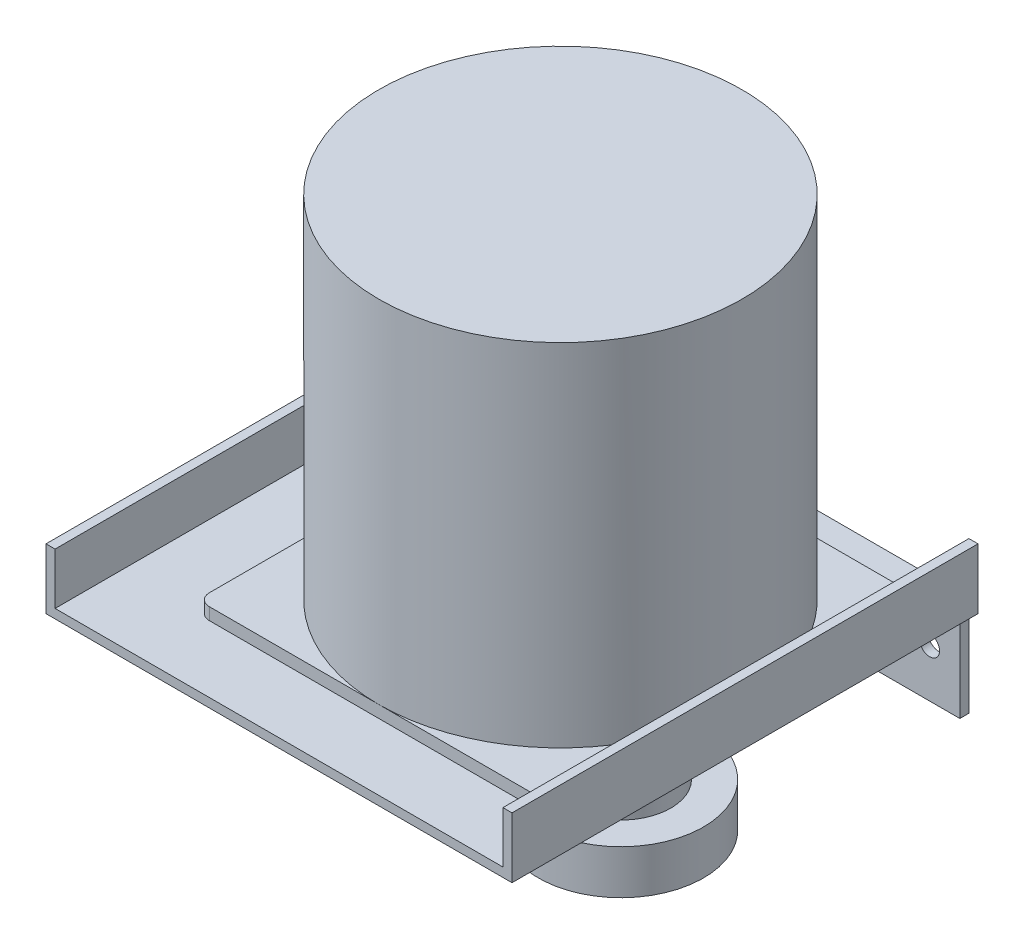
ISO-10303-21;
HEADER;
FILE_DESCRIPTION(('STEP AP214'),'2;1');
FILE_NAME('part.step','',(''),(''),'','','');
FILE_SCHEMA(('AUTOMOTIVE_DESIGN { 1 0 10303 214 1 1 1 1 }'));
ENDSEC;
DATA;
#1=APPLICATION_CONTEXT('core data for automotive mechanical design processes');
#2=APPLICATION_PROTOCOL_DEFINITION('international standard','automotive_design',2000,#1);
#3=PRODUCT_CONTEXT('',#1,'mechanical');
#4=PRODUCT('Part','Part','',(#3));
#5=PRODUCT_RELATED_PRODUCT_CATEGORY('part','',(#4));
#6=PRODUCT_DEFINITION_FORMATION('','',#4);
#7=PRODUCT_DEFINITION_CONTEXT('part definition',#1,'design');
#8=PRODUCT_DEFINITION('design','',#6,#7);
#9=PRODUCT_DEFINITION_SHAPE('','',#8);
#10=(LENGTH_UNIT() NAMED_UNIT(*) SI_UNIT(.MILLI.,.METRE.));
#11=(NAMED_UNIT(*) PLANE_ANGLE_UNIT() SI_UNIT($,.RADIAN.));
#12=(NAMED_UNIT(*) SI_UNIT($,.STERADIAN.) SOLID_ANGLE_UNIT());
#13=UNCERTAINTY_MEASURE_WITH_UNIT(LENGTH_MEASURE(1.E-05),#10,'distance_accuracy_value','');
#14=(GEOMETRIC_REPRESENTATION_CONTEXT(3) GLOBAL_UNCERTAINTY_ASSIGNED_CONTEXT((#13)) GLOBAL_UNIT_ASSIGNED_CONTEXT((#10,
#11,#12)) REPRESENTATION_CONTEXT('',''));
#15=CARTESIAN_POINT('',(0.,0.,0.));
#16=DIRECTION('',(0.,0.,1.));
#17=DIRECTION('',(1.,0.,0.));
#18=AXIS2_PLACEMENT_3D('',#15,#16,#17);
#19=CARTESIAN_POINT('',(-44.,-3.5,-36.));
#20=DIRECTION('',(0.,0.,1.));
#21=DIRECTION('',(1.,0.,0.));
#22=AXIS2_PLACEMENT_3D('',#19,#20,#21);
#23=PLANE('',#22);
#24=CARTESIAN_POINT('',(26.5,-10.5,-36.));
#25=DIRECTION('',(0.,0.,-1.));
#26=DIRECTION('',(-1.,0.,0.));
#27=AXIS2_PLACEMENT_3D('',#24,#25,#26);
#28=CIRCLE('',#27,1.65);
#29=CARTESIAN_POINT('',(24.85,-10.5,-36.));
#30=VERTEX_POINT('',#29);
#31=EDGE_CURVE('E661',#30,#30,#28,.T.);
#32=ORIENTED_EDGE('',*,*,#31,.F.);
#33=EDGE_LOOP('',(#32));
#34=FACE_BOUND('',#33,.T.);
#35=DIRECTION('',(0.,1.,0.));
#36=VECTOR('',#35,1.);
#37=CARTESIAN_POINT('',(-44.,-3.5,-36.));
#38=LINE('',#37,#36);
#39=CARTESIAN_POINT('',(-44.,-3.5,-36.));
#40=VERTEX_POINT('',#39);
#41=CARTESIAN_POINT('',(-44.,6.5,-36.));
#42=VERTEX_POINT('',#41);
#43=EDGE_CURVE('E269',#40,#42,#38,.T.);
#44=ORIENTED_EDGE('',*,*,#43,.T.);
#45=DIRECTION('',(-1.,0.,0.));
#46=VECTOR('',#45,1.);
#47=CARTESIAN_POINT('',(-44.,6.5,-36.));
#48=LINE('',#47,#46);
#49=CARTESIAN_POINT('',(-42.5,6.5,-36.));
#50=VERTEX_POINT('',#49);
#51=EDGE_CURVE('E225',#50,#42,#48,.T.);
#52=ORIENTED_EDGE('',*,*,#51,.F.);
#53=DIRECTION('',(0.,-1.,0.));
#54=VECTOR('',#53,1.);
#55=CARTESIAN_POINT('',(-42.5,6.5,-36.));
#56=LINE('',#55,#54);
#57=CARTESIAN_POINT('',(-42.5,-2.,-36.));
#58=VERTEX_POINT('',#57);
#59=EDGE_CURVE('E227',#50,#58,#56,.T.);
#60=ORIENTED_EDGE('',*,*,#59,.T.);
#61=DIRECTION('',(1.,0.,0.));
#62=VECTOR('',#61,1.);
#63=CARTESIAN_POINT('',(-44.,-2.,-36.));
#64=LINE('',#63,#62);
#65=CARTESIAN_POINT('',(31.5,-2.,-36.));
#66=VERTEX_POINT('',#65);
#67=EDGE_CURVE('E258',#58,#66,#64,.T.);
#68=ORIENTED_EDGE('',*,*,#67,.T.);
#69=DIRECTION('',(0.,-1.,0.));
#70=VECTOR('',#69,1.);
#71=CARTESIAN_POINT('',(31.5,6.5,-36.));
#72=LINE('',#71,#70);
#73=CARTESIAN_POINT('',(31.5,6.5,-36.));
#74=VERTEX_POINT('',#73);
#75=EDGE_CURVE('E250',#74,#66,#72,.T.);
#76=ORIENTED_EDGE('',*,*,#75,.F.);
#77=DIRECTION('',(-1.,0.,0.));
#78=VECTOR('',#77,1.);
#79=CARTESIAN_POINT('',(33.,6.5,-36.));
#80=LINE('',#79,#78);
#81=CARTESIAN_POINT('',(33.,6.5,-36.));
#82=VERTEX_POINT('',#81);
#83=EDGE_CURVE('E238',#82,#74,#80,.T.);
#84=ORIENTED_EDGE('',*,*,#83,.F.);
#85=DIRECTION('',(0.,1.,0.));
#86=VECTOR('',#85,1.);
#87=CARTESIAN_POINT('',(33.,-3.5,-36.));
#88=LINE('',#87,#86);
#89=CARTESIAN_POINT('',(33.,-3.5,-36.));
#90=VERTEX_POINT('',#89);
#91=EDGE_CURVE('E272',#90,#82,#88,.T.);
#92=ORIENTED_EDGE('',*,*,#91,.F.);
#93=DIRECTION('',(1.,0.,0.));
#94=VECTOR('',#93,1.);
#95=CARTESIAN_POINT('',(-44.,-3.5,-36.));
#96=LINE('',#95,#94);
#97=CARTESIAN_POINT('',(31.5,-3.5,-36.));
#98=VERTEX_POINT('',#97);
#99=EDGE_CURVE('E263',#98,#90,#96,.T.);
#100=ORIENTED_EDGE('',*,*,#99,.F.);
#101=DIRECTION('',(0.,1.,0.));
#102=VECTOR('',#101,1.);
#103=CARTESIAN_POINT('',(31.5,-18.5,-36.));
#104=LINE('',#103,#102);
#105=CARTESIAN_POINT('',(31.5,-18.5,-36.));
#106=VERTEX_POINT('',#105);
#107=EDGE_CURVE('E194',#106,#98,#104,.T.);
#108=ORIENTED_EDGE('',*,*,#107,.F.);
#109=DIRECTION('',(1.,0.,0.));
#110=VECTOR('',#109,1.);
#111=CARTESIAN_POINT('',(-42.5,-18.5,-36.));
#112=LINE('',#111,#110);
#113=CARTESIAN_POINT('',(-42.5,-18.5,-36.));
#114=VERTEX_POINT('',#113);
#115=EDGE_CURVE('E187',#114,#106,#112,.T.);
#116=ORIENTED_EDGE('',*,*,#115,.F.);
#117=DIRECTION('',(0.,1.,0.));
#118=VECTOR('',#117,1.);
#119=CARTESIAN_POINT('',(-42.5,-18.5,-36.));
#120=LINE('',#119,#118);
#121=CARTESIAN_POINT('',(-42.5,-3.5,-36.));
#122=VERTEX_POINT('',#121);
#123=EDGE_CURVE('E192',#114,#122,#120,.T.);
#124=ORIENTED_EDGE('',*,*,#123,.T.);
#125=EDGE_CURVE('E264',#40,#122,#96,.T.);
#126=ORIENTED_EDGE('',*,*,#125,.F.);
#127=EDGE_LOOP('',(#44,#52,#60,#68,#76,#84,#92,#100,#108,#116,#124,#126));
#128=FACE_BOUND('',#127,.T.);
#129=CARTESIAN_POINT('',(-37.5,-10.5,-36.));
#130=DIRECTION('',(0.,0.,-1.));
#131=DIRECTION('',(-1.,0.,0.));
#132=AXIS2_PLACEMENT_3D('',#129,#130,#131);
#133=CIRCLE('',#132,1.65);
#134=CARTESIAN_POINT('',(-39.15,-10.5,-36.));
#135=VERTEX_POINT('',#134);
#136=EDGE_CURVE('E667',#135,#135,#133,.T.);
#137=ORIENTED_EDGE('',*,*,#136,.F.);
#138=EDGE_LOOP('',(#137));
#139=FACE_BOUND('',#138,.T.);
#140=ADVANCED_FACE('F39',(#34,#128,#139),#23,.F.);
#141=CARTESIAN_POINT('',(0.,-3.5,0.));
#142=DIRECTION('',(0.,1.,0.));
#143=DIRECTION('',(0.,0.,1.));
#144=AXIS2_PLACEMENT_3D('',#141,#142,#143);
#145=PLANE('',#144);
#146=CARTESIAN_POINT('',(9.5,-3.5,-0.5));
#147=DIRECTION('',(0.,1.,0.));
#148=DIRECTION('',(0.,0.,1.));
#149=AXIS2_PLACEMENT_3D('',#146,#147,#148);
#150=CIRCLE('',#149,3.5);
#151=CARTESIAN_POINT('',(9.5,-3.5,3.));
#152=VERTEX_POINT('',#151);
#153=EDGE_CURVE('E11',#152,#152,#150,.F.);
#154=ORIENTED_EDGE('',*,*,#153,.F.);
#155=EDGE_LOOP('',(#154));
#156=FACE_BOUND('',#155,.T.);
#157=DIRECTION('',(0.,0.,-1.));
#158=VECTOR('',#157,1.);
#159=CARTESIAN_POINT('',(-42.5,-3.5,-36.));
#160=LINE('',#159,#158);
#161=CARTESIAN_POINT('',(-42.5,-3.5,-34.5));
#162=VERTEX_POINT('',#161);
#163=EDGE_CURVE('E54',#162,#122,#160,.T.);
#164=ORIENTED_EDGE('',*,*,#163,.F.);
#165=DIRECTION('',(-1.,0.,0.));
#166=VECTOR('',#165,1.);
#167=CARTESIAN_POINT('',(-42.5,-3.5,-34.5));
#168=LINE('',#167,#166);
#169=CARTESIAN_POINT('',(31.5,-3.5,-34.5));
#170=VERTEX_POINT('',#169);
#171=EDGE_CURVE('E207',#170,#162,#168,.T.);
#172=ORIENTED_EDGE('',*,*,#171,.F.);
#173=DIRECTION('',(0.,0.,1.));
#174=VECTOR('',#173,1.);
#175=CARTESIAN_POINT('',(31.5,-3.5,-36.));
#176=LINE('',#175,#174);
#177=EDGE_CURVE('E60',#98,#170,#176,.T.);
#178=ORIENTED_EDGE('',*,*,#177,.F.);
#179=ORIENTED_EDGE('',*,*,#99,.T.);
#180=DIRECTION('',(0.,0.,1.));
#181=VECTOR('',#180,1.);
#182=CARTESIAN_POINT('',(33.,-3.5,-36.));
#183=LINE('',#182,#181);
#184=CARTESIAN_POINT('',(33.,-3.5,41.));
#185=VERTEX_POINT('',#184);
#186=EDGE_CURVE('E261',#90,#185,#183,.T.);
#187=ORIENTED_EDGE('',*,*,#186,.T.);
#188=DIRECTION('',(1.,0.,0.));
#189=VECTOR('',#188,1.);
#190=CARTESIAN_POINT('',(-44.,-3.5,41.));
#191=LINE('',#190,#189);
#192=CARTESIAN_POINT('',(-44.,-3.5,41.));
#193=VERTEX_POINT('',#192);
#194=EDGE_CURVE('E257',#193,#185,#191,.T.);
#195=ORIENTED_EDGE('',*,*,#194,.F.);
#196=DIRECTION('',(0.,0.,1.));
#197=VECTOR('',#196,1.);
#198=CARTESIAN_POINT('',(-44.,-3.5,-36.));
#199=LINE('',#198,#197);
#200=EDGE_CURVE('E254',#40,#193,#199,.T.);
#201=ORIENTED_EDGE('',*,*,#200,.F.);
#202=ORIENTED_EDGE('',*,*,#125,.T.);
#203=EDGE_LOOP('',(#164,#172,#178,#179,#187,#195,#201,#202));
#204=FACE_BOUND('',#203,.T.);
#205=ADVANCED_FACE('F413',(#156,#204),#145,.F.);
#206=CARTESIAN_POINT('',(0.,-2.,0.));
#207=DIRECTION('',(0.,1.,0.));
#208=DIRECTION('',(0.,0.,1.));
#209=AXIS2_PLACEMENT_3D('',#206,#207,#208);
#210=PLANE('',#209);
#211=CARTESIAN_POINT('',(28.,-2.,28.));
#212=DIRECTION('',(0.,1.,0.));
#213=DIRECTION('',(0.,0.,1.));
#214=AXIS2_PLACEMENT_3D('',#211,#212,#213);
#215=CIRCLE('',#214,2.);
#216=CARTESIAN_POINT('',(30.,-2.,28.));
#217=VERTEX_POINT('',#216);
#218=CARTESIAN_POINT('',(28.,-2.,30.));
#219=VERTEX_POINT('',#218);
#220=EDGE_CURVE('E320',#217,#219,#215,.F.);
#221=ORIENTED_EDGE('',*,*,#220,.T.);
#222=DIRECTION('',(-1.,0.,0.));
#223=VECTOR('',#222,1.);
#224=CARTESIAN_POINT('',(-30.,-2.,30.));
#225=LINE('',#224,#223);
#226=CARTESIAN_POINT('',(-28.,-2.,30.));
#227=VERTEX_POINT('',#226);
#228=EDGE_CURVE('E280',#219,#227,#225,.T.);
#229=ORIENTED_EDGE('',*,*,#228,.T.);
#230=CARTESIAN_POINT('',(-28.,-2.,28.));
#231=DIRECTION('',(0.,1.,0.));
#232=DIRECTION('',(0.,0.,1.));
#233=AXIS2_PLACEMENT_3D('',#230,#231,#232);
#234=CIRCLE('',#233,2.);
#235=CARTESIAN_POINT('',(-30.,-2.,28.));
#236=VERTEX_POINT('',#235);
#237=EDGE_CURVE('E329',#227,#236,#234,.F.);
#238=ORIENTED_EDGE('',*,*,#237,.T.);
#239=DIRECTION('',(0.,0.,-1.));
#240=VECTOR('',#239,1.);
#241=CARTESIAN_POINT('',(-30.,-2.,-30.));
#242=LINE('',#241,#240);
#243=CARTESIAN_POINT('',(-30.,-2.,-28.));
#244=VERTEX_POINT('',#243);
#245=EDGE_CURVE('E284',#236,#244,#242,.T.);
#246=ORIENTED_EDGE('',*,*,#245,.T.);
#247=CARTESIAN_POINT('',(-28.,-2.,-28.));
#248=DIRECTION('',(0.,1.,0.));
#249=DIRECTION('',(0.,0.,1.));
#250=AXIS2_PLACEMENT_3D('',#247,#248,#249);
#251=CIRCLE('',#250,2.);
#252=CARTESIAN_POINT('',(-28.,-2.,-30.));
#253=VERTEX_POINT('',#252);
#254=EDGE_CURVE('E326',#244,#253,#251,.F.);
#255=ORIENTED_EDGE('',*,*,#254,.T.);
#256=DIRECTION('',(1.,0.,0.));
#257=VECTOR('',#256,1.);
#258=CARTESIAN_POINT('',(-30.,-2.,-30.));
#259=LINE('',#258,#257);
#260=CARTESIAN_POINT('',(28.,-2.,-30.));
#261=VERTEX_POINT('',#260);
#262=EDGE_CURVE('E287',#253,#261,#259,.T.);
#263=ORIENTED_EDGE('',*,*,#262,.T.);
#264=CARTESIAN_POINT('',(28.,-2.,-28.));
#265=DIRECTION('',(0.,1.,0.));
#266=DIRECTION('',(0.,0.,1.));
#267=AXIS2_PLACEMENT_3D('',#264,#265,#266);
#268=CIRCLE('',#267,2.);
#269=CARTESIAN_POINT('',(30.,-2.,-28.));
#270=VERTEX_POINT('',#269);
#271=EDGE_CURVE('E323',#261,#270,#268,.F.);
#272=ORIENTED_EDGE('',*,*,#271,.T.);
#273=DIRECTION('',(0.,0.,1.));
#274=VECTOR('',#273,1.);
#275=CARTESIAN_POINT('',(30.,-2.,-30.));
#276=LINE('',#275,#274);
#277=EDGE_CURVE('E277',#270,#217,#276,.T.);
#278=ORIENTED_EDGE('',*,*,#277,.T.);
#279=EDGE_LOOP('',(#221,#229,#238,#246,#255,#263,#272,#278));
#280=FACE_BOUND('',#279,.T.);
#281=ORIENTED_EDGE('',*,*,#67,.F.);
#282=DIRECTION('',(0.,0.,-1.));
#283=VECTOR('',#282,1.);
#284=CARTESIAN_POINT('',(-42.5,-2.,41.));
#285=LINE('',#284,#283);
#286=CARTESIAN_POINT('',(-42.5,-2.,41.));
#287=VERTEX_POINT('',#286);
#288=EDGE_CURVE('E210',#287,#58,#285,.T.);
#289=ORIENTED_EDGE('',*,*,#288,.F.);
#290=DIRECTION('',(1.,0.,0.));
#291=VECTOR('',#290,1.);
#292=CARTESIAN_POINT('',(-44.,-2.,41.));
#293=LINE('',#292,#291);
#294=CARTESIAN_POINT('',(31.5,-2.,41.));
#295=VERTEX_POINT('',#294);
#296=EDGE_CURVE('E253',#287,#295,#293,.T.);
#297=ORIENTED_EDGE('',*,*,#296,.T.);
#298=DIRECTION('',(0.,0.,1.));
#299=VECTOR('',#298,1.);
#300=CARTESIAN_POINT('',(31.5,-2.,41.));
#301=LINE('',#300,#299);
#302=EDGE_CURVE('E234',#66,#295,#301,.T.);
#303=ORIENTED_EDGE('',*,*,#302,.F.);
#304=EDGE_LOOP('',(#281,#289,#297,#303));
#305=FACE_BOUND('',#304,.T.);
#306=ADVANCED_FACE('F360',(#280,#305),#210,.T.);
#307=CARTESIAN_POINT('',(0.,58.,0.));
#308=DIRECTION('',(0.,-1.,0.));
#309=DIRECTION('',(0.,0.,-1.));
#310=AXIS2_PLACEMENT_3D('',#307,#308,#309);
#311=CYLINDRICAL_SURFACE('',#310,30.);
#312=CARTESIAN_POINT('',(0.,58.,0.));
#313=DIRECTION('',(0.,1.,0.));
#314=DIRECTION('',(0.,0.,1.));
#315=AXIS2_PLACEMENT_3D('',#312,#313,#314);
#316=CIRCLE('',#315,30.);
#317=CARTESIAN_POINT('',(0.,58.,30.));
#318=VERTEX_POINT('',#317);
#319=EDGE_CURVE('E301',#318,#318,#316,.T.);
#320=ORIENTED_EDGE('',*,*,#319,.F.);
#321=EDGE_LOOP('',(#320));
#322=FACE_BOUND('',#321,.T.);
#323=CARTESIAN_POINT('',(0.,0.,0.));
#324=DIRECTION('',(0.,1.,0.));
#325=DIRECTION('',(0.,0.,1.));
#326=AXIS2_PLACEMENT_3D('',#323,#324,#325);
#327=CIRCLE('',#326,30.);
#328=CARTESIAN_POINT('',(0.,0.,30.));
#329=VERTEX_POINT('',#328);
#330=CARTESIAN_POINT('',(30.,0.,0.));
#331=VERTEX_POINT('',#330);
#332=EDGE_CURVE('E305',#329,#331,#327,.T.);
#333=ORIENTED_EDGE('',*,*,#332,.T.);
#334=CARTESIAN_POINT('',(0.,0.,-30.));
#335=VERTEX_POINT('',#334);
#336=EDGE_CURVE('E308',#331,#335,#327,.T.);
#337=ORIENTED_EDGE('',*,*,#336,.T.);
#338=CARTESIAN_POINT('',(-30.,0.,0.));
#339=VERTEX_POINT('',#338);
#340=EDGE_CURVE('E380',#335,#339,#327,.T.);
#341=ORIENTED_EDGE('',*,*,#340,.T.);
#342=EDGE_CURVE('E290',#339,#329,#327,.T.);
#343=ORIENTED_EDGE('',*,*,#342,.T.);
#344=EDGE_LOOP('',(#333,#337,#341,#343));
#345=FACE_BOUND('',#344,.T.);
#346=ADVANCED_FACE('F386',(#322,#345),#311,.T.);
#347=CARTESIAN_POINT('',(0.,58.,0.));
#348=DIRECTION('',(0.,1.,0.));
#349=DIRECTION('',(0.,0.,1.));
#350=AXIS2_PLACEMENT_3D('',#347,#348,#349);
#351=PLANE('',#350);
#352=ORIENTED_EDGE('',*,*,#319,.T.);
#353=EDGE_LOOP('',(#352));
#354=FACE_BOUND('',#353,.T.);
#355=ADVANCED_FACE('F439',(#354),#351,.T.);
#356=CARTESIAN_POINT('',(0.,0.,0.));
#357=DIRECTION('',(0.,1.,0.));
#358=DIRECTION('',(0.,0.,1.));
#359=AXIS2_PLACEMENT_3D('',#356,#357,#358);
#360=PLANE('',#359);
#361=DIRECTION('',(-1.,0.,0.));
#362=VECTOR('',#361,1.);
#363=CARTESIAN_POINT('',(-30.,0.,30.));
#364=LINE('',#363,#362);
#365=CARTESIAN_POINT('',(28.,0.,30.));
#366=VERTEX_POINT('',#365);
#367=EDGE_CURVE('E294',#366,#329,#364,.T.);
#368=ORIENTED_EDGE('',*,*,#367,.F.);
#369=CARTESIAN_POINT('',(28.,0.,28.));
#370=DIRECTION('',(0.,1.,0.));
#371=DIRECTION('',(0.,0.,1.));
#372=AXIS2_PLACEMENT_3D('',#369,#370,#371);
#373=CIRCLE('',#372,2.);
#374=CARTESIAN_POINT('',(30.,0.,28.));
#375=VERTEX_POINT('',#374);
#376=EDGE_CURVE('E47',#366,#375,#373,.T.);
#377=ORIENTED_EDGE('',*,*,#376,.T.);
#378=DIRECTION('',(0.,0.,1.));
#379=VECTOR('',#378,1.);
#380=CARTESIAN_POINT('',(30.,0.,-30.));
#381=LINE('',#380,#379);
#382=EDGE_CURVE('E271',#331,#375,#381,.T.);
#383=ORIENTED_EDGE('',*,*,#382,.F.);
#384=ORIENTED_EDGE('',*,*,#332,.F.);
#385=EDGE_LOOP('',(#368,#377,#383,#384));
#386=FACE_BOUND('',#385,.T.);
#387=ADVANCED_FACE('F349',(#386),#360,.T.);
#388=CARTESIAN_POINT('',(30.,0.,-28.));
#389=VERTEX_POINT('',#388);
#390=EDGE_CURVE('E291',#389,#331,#381,.T.);
#391=ORIENTED_EDGE('',*,*,#390,.F.);
#392=CARTESIAN_POINT('',(28.,0.,-28.));
#393=DIRECTION('',(0.,1.,0.));
#394=DIRECTION('',(0.,0.,1.));
#395=AXIS2_PLACEMENT_3D('',#392,#393,#394);
#396=CIRCLE('',#395,2.);
#397=CARTESIAN_POINT('',(28.,0.,-30.));
#398=VERTEX_POINT('',#397);
#399=EDGE_CURVE('E344',#389,#398,#396,.T.);
#400=ORIENTED_EDGE('',*,*,#399,.T.);
#401=DIRECTION('',(1.,0.,0.));
#402=VECTOR('',#401,1.);
#403=CARTESIAN_POINT('',(-30.,0.,-30.));
#404=LINE('',#403,#402);
#405=EDGE_CURVE('E299',#335,#398,#404,.T.);
#406=ORIENTED_EDGE('',*,*,#405,.F.);
#407=ORIENTED_EDGE('',*,*,#336,.F.);
#408=EDGE_LOOP('',(#391,#400,#406,#407));
#409=FACE_BOUND('',#408,.T.);
#410=ADVANCED_FACE('F370',(#409),#360,.T.);
#411=CARTESIAN_POINT('',(-28.,0.,-30.));
#412=VERTEX_POINT('',#411);
#413=EDGE_CURVE('E281',#412,#335,#404,.T.);
#414=ORIENTED_EDGE('',*,*,#413,.F.);
#415=CARTESIAN_POINT('',(-28.,0.,-28.));
#416=DIRECTION('',(0.,1.,0.));
#417=DIRECTION('',(0.,0.,1.));
#418=AXIS2_PLACEMENT_3D('',#415,#416,#417);
#419=CIRCLE('',#418,2.);
#420=CARTESIAN_POINT('',(-30.,0.,-28.));
#421=VERTEX_POINT('',#420);
#422=EDGE_CURVE('E337',#412,#421,#419,.T.);
#423=ORIENTED_EDGE('',*,*,#422,.T.);
#424=DIRECTION('',(0.,0.,-1.));
#425=VECTOR('',#424,1.);
#426=CARTESIAN_POINT('',(-30.,0.,-30.));
#427=LINE('',#426,#425);
#428=EDGE_CURVE('E296',#339,#421,#427,.T.);
#429=ORIENTED_EDGE('',*,*,#428,.F.);
#430=ORIENTED_EDGE('',*,*,#340,.F.);
#431=EDGE_LOOP('',(#414,#423,#429,#430));
#432=FACE_BOUND('',#431,.T.);
#433=ADVANCED_FACE('F381',(#432),#360,.T.);
#434=CARTESIAN_POINT('',(-30.,0.,28.));
#435=VERTEX_POINT('',#434);
#436=EDGE_CURVE('E297',#435,#339,#427,.T.);
#437=ORIENTED_EDGE('',*,*,#436,.F.);
#438=CARTESIAN_POINT('',(-28.,0.,28.));
#439=DIRECTION('',(0.,1.,0.));
#440=DIRECTION('',(0.,0.,1.));
#441=AXIS2_PLACEMENT_3D('',#438,#439,#440);
#442=CIRCLE('',#441,2.);
#443=CARTESIAN_POINT('',(-28.,0.,30.));
#444=VERTEX_POINT('',#443);
#445=EDGE_CURVE('E313',#435,#444,#442,.T.);
#446=ORIENTED_EDGE('',*,*,#445,.T.);
#447=EDGE_CURVE('E293',#329,#444,#364,.T.);
#448=ORIENTED_EDGE('',*,*,#447,.F.);
#449=ORIENTED_EDGE('',*,*,#342,.F.);
#450=EDGE_LOOP('',(#437,#446,#448,#449));
#451=FACE_BOUND('',#450,.T.);
#452=ADVANCED_FACE('F390',(#451),#360,.T.);
#453=CARTESIAN_POINT('',(30.,-2.,-30.));
#454=DIRECTION('',(-1.,0.,0.));
#455=DIRECTION('',(0.,0.,1.));
#456=AXIS2_PLACEMENT_3D('',#453,#454,#455);
#457=PLANE('',#456);
#458=ORIENTED_EDGE('',*,*,#277,.F.);
#459=DIRECTION('',(0.,1.,0.));
#460=VECTOR('',#459,1.);
#461=CARTESIAN_POINT('',(30.,-2.,-28.));
#462=LINE('',#461,#460);
#463=EDGE_CURVE('E341',#270,#389,#462,.T.);
#464=ORIENTED_EDGE('',*,*,#463,.T.);
#465=ORIENTED_EDGE('',*,*,#390,.T.);
#466=ORIENTED_EDGE('',*,*,#382,.T.);
#467=DIRECTION('',(0.,1.,0.));
#468=VECTOR('',#467,1.);
#469=CARTESIAN_POINT('',(30.,-2.,28.));
#470=LINE('',#469,#468);
#471=EDGE_CURVE('E339',#375,#217,#470,.F.);
#472=ORIENTED_EDGE('',*,*,#471,.T.);
#473=EDGE_LOOP('',(#458,#464,#465,#466,#472));
#474=FACE_BOUND('',#473,.T.);
#475=ADVANCED_FACE('F354',(#474),#457,.F.);
#476=CARTESIAN_POINT('',(-30.,-2.,30.));
#477=DIRECTION('',(0.,0.,-1.));
#478=DIRECTION('',(-1.,0.,0.));
#479=AXIS2_PLACEMENT_3D('',#476,#477,#478);
#480=PLANE('',#479);
#481=ORIENTED_EDGE('',*,*,#447,.T.);
#482=DIRECTION('',(0.,1.,0.));
#483=VECTOR('',#482,1.);
#484=CARTESIAN_POINT('',(-28.,-2.,30.));
#485=LINE('',#484,#483);
#486=EDGE_CURVE('E318',#444,#227,#485,.F.);
#487=ORIENTED_EDGE('',*,*,#486,.T.);
#488=ORIENTED_EDGE('',*,*,#228,.F.);
#489=DIRECTION('',(0.,1.,0.));
#490=VECTOR('',#489,1.);
#491=CARTESIAN_POINT('',(28.,-2.,30.));
#492=LINE('',#491,#490);
#493=EDGE_CURVE('E315',#219,#366,#492,.T.);
#494=ORIENTED_EDGE('',*,*,#493,.T.);
#495=ORIENTED_EDGE('',*,*,#367,.T.);
#496=EDGE_LOOP('',(#481,#487,#488,#494,#495));
#497=FACE_BOUND('',#496,.T.);
#498=ADVANCED_FACE('F394',(#497),#480,.F.);
#499=CARTESIAN_POINT('',(-30.,-2.,-30.));
#500=DIRECTION('',(1.,0.,0.));
#501=DIRECTION('',(0.,0.,-1.));
#502=AXIS2_PLACEMENT_3D('',#499,#500,#501);
#503=PLANE('',#502);
#504=ORIENTED_EDGE('',*,*,#245,.F.);
#505=DIRECTION('',(0.,1.,0.));
#506=VECTOR('',#505,1.);
#507=CARTESIAN_POINT('',(-30.,-2.,28.));
#508=LINE('',#507,#506);
#509=EDGE_CURVE('E310',#236,#435,#508,.T.);
#510=ORIENTED_EDGE('',*,*,#509,.T.);
#511=ORIENTED_EDGE('',*,*,#436,.T.);
#512=ORIENTED_EDGE('',*,*,#428,.T.);
#513=DIRECTION('',(0.,1.,0.));
#514=VECTOR('',#513,1.);
#515=CARTESIAN_POINT('',(-30.,-2.,-28.));
#516=LINE('',#515,#514);
#517=EDGE_CURVE('E304',#421,#244,#516,.F.);
#518=ORIENTED_EDGE('',*,*,#517,.T.);
#519=EDGE_LOOP('',(#504,#510,#511,#512,#518));
#520=FACE_BOUND('',#519,.T.);
#521=ADVANCED_FACE('F401',(#520),#503,.F.);
#522=CARTESIAN_POINT('',(-30.,-2.,-30.));
#523=DIRECTION('',(0.,0.,1.));
#524=DIRECTION('',(1.,0.,0.));
#525=AXIS2_PLACEMENT_3D('',#522,#523,#524);
#526=PLANE('',#525);
#527=ORIENTED_EDGE('',*,*,#262,.F.);
#528=DIRECTION('',(0.,1.,0.));
#529=VECTOR('',#528,1.);
#530=CARTESIAN_POINT('',(-28.,-2.,-30.));
#531=LINE('',#530,#529);
#532=EDGE_CURVE('E334',#253,#412,#531,.T.);
#533=ORIENTED_EDGE('',*,*,#532,.T.);
#534=ORIENTED_EDGE('',*,*,#413,.T.);
#535=ORIENTED_EDGE('',*,*,#405,.T.);
#536=DIRECTION('',(0.,1.,0.));
#537=VECTOR('',#536,1.);
#538=CARTESIAN_POINT('',(28.,-2.,-30.));
#539=LINE('',#538,#537);
#540=EDGE_CURVE('E332',#398,#261,#539,.F.);
#541=ORIENTED_EDGE('',*,*,#540,.T.);
#542=EDGE_LOOP('',(#527,#533,#534,#535,#541));
#543=FACE_BOUND('',#542,.T.);
#544=ADVANCED_FACE('F373',(#543),#526,.F.);
#545=CARTESIAN_POINT('',(-28.,-2.,28.));
#546=DIRECTION('',(0.,1.,0.));
#547=DIRECTION('',(0.,0.,1.));
#548=AXIS2_PLACEMENT_3D('',#545,#546,#547);
#549=CYLINDRICAL_SURFACE('',#548,2.);
#550=ORIENTED_EDGE('',*,*,#237,.F.);
#551=ORIENTED_EDGE('',*,*,#486,.F.);
#552=ORIENTED_EDGE('',*,*,#445,.F.);
#553=ORIENTED_EDGE('',*,*,#509,.F.);
#554=EDGE_LOOP('',(#550,#551,#552,#553));
#555=FACE_BOUND('',#554,.T.);
#556=ADVANCED_FACE('F397',(#555),#549,.T.);
#557=CARTESIAN_POINT('',(-28.,-2.,-28.));
#558=DIRECTION('',(0.,1.,0.));
#559=DIRECTION('',(0.,0.,1.));
#560=AXIS2_PLACEMENT_3D('',#557,#558,#559);
#561=CYLINDRICAL_SURFACE('',#560,2.);
#562=ORIENTED_EDGE('',*,*,#254,.F.);
#563=ORIENTED_EDGE('',*,*,#517,.F.);
#564=ORIENTED_EDGE('',*,*,#422,.F.);
#565=ORIENTED_EDGE('',*,*,#532,.F.);
#566=EDGE_LOOP('',(#562,#563,#564,#565));
#567=FACE_BOUND('',#566,.T.);
#568=ADVANCED_FACE('F404',(#567),#561,.T.);
#569=CARTESIAN_POINT('',(28.,-2.,-28.));
#570=DIRECTION('',(0.,1.,0.));
#571=DIRECTION('',(0.,0.,1.));
#572=AXIS2_PLACEMENT_3D('',#569,#570,#571);
#573=CYLINDRICAL_SURFACE('',#572,2.);
#574=ORIENTED_EDGE('',*,*,#271,.F.);
#575=ORIENTED_EDGE('',*,*,#540,.F.);
#576=ORIENTED_EDGE('',*,*,#399,.F.);
#577=ORIENTED_EDGE('',*,*,#463,.F.);
#578=EDGE_LOOP('',(#574,#575,#576,#577));
#579=FACE_BOUND('',#578,.T.);
#580=ADVANCED_FACE('F365',(#579),#573,.T.);
#581=CARTESIAN_POINT('',(28.,-2.,28.));
#582=DIRECTION('',(0.,1.,0.));
#583=DIRECTION('',(0.,0.,1.));
#584=AXIS2_PLACEMENT_3D('',#581,#582,#583);
#585=CYLINDRICAL_SURFACE('',#584,2.);
#586=ORIENTED_EDGE('',*,*,#220,.F.);
#587=ORIENTED_EDGE('',*,*,#471,.F.);
#588=ORIENTED_EDGE('',*,*,#376,.F.);
#589=ORIENTED_EDGE('',*,*,#493,.F.);
#590=EDGE_LOOP('',(#586,#587,#588,#589));
#591=FACE_BOUND('',#590,.T.);
#592=ADVANCED_FACE('F41',(#591),#585,.T.);
#593=CARTESIAN_POINT('',(-44.,-3.5,-36.));
#594=DIRECTION('',(-1.,0.,0.));
#595=DIRECTION('',(0.,0.,1.));
#596=AXIS2_PLACEMENT_3D('',#593,#594,#595);
#597=PLANE('',#596);
#598=DIRECTION('',(0.,1.,0.));
#599=VECTOR('',#598,1.);
#600=CARTESIAN_POINT('',(-44.,-3.5,41.));
#601=LINE('',#600,#599);
#602=CARTESIAN_POINT('',(-44.,6.5,41.));
#603=VERTEX_POINT('',#602);
#604=EDGE_CURVE('E266',#193,#603,#601,.T.);
#605=ORIENTED_EDGE('',*,*,#604,.T.);
#606=DIRECTION('',(0.,0.,1.));
#607=VECTOR('',#606,1.);
#608=CARTESIAN_POINT('',(-44.,6.5,41.));
#609=LINE('',#608,#607);
#610=EDGE_CURVE('E213',#42,#603,#609,.T.);
#611=ORIENTED_EDGE('',*,*,#610,.F.);
#612=ORIENTED_EDGE('',*,*,#43,.F.);
#613=ORIENTED_EDGE('',*,*,#200,.T.);
#614=EDGE_LOOP('',(#605,#611,#612,#613));
#615=FACE_BOUND('',#614,.T.);
#616=ADVANCED_FACE('F428',(#615),#597,.T.);
#617=CARTESIAN_POINT('',(33.,-3.5,-36.));
#618=DIRECTION('',(-1.,0.,0.));
#619=DIRECTION('',(0.,0.,1.));
#620=AXIS2_PLACEMENT_3D('',#617,#618,#619);
#621=PLANE('',#620);
#622=ORIENTED_EDGE('',*,*,#91,.T.);
#623=DIRECTION('',(0.,0.,-1.));
#624=VECTOR('',#623,1.);
#625=CARTESIAN_POINT('',(33.,6.5,41.));
#626=LINE('',#625,#624);
#627=CARTESIAN_POINT('',(33.,6.5,41.));
#628=VERTEX_POINT('',#627);
#629=EDGE_CURVE('E235',#628,#82,#626,.T.);
#630=ORIENTED_EDGE('',*,*,#629,.F.);
#631=DIRECTION('',(0.,1.,0.));
#632=VECTOR('',#631,1.);
#633=CARTESIAN_POINT('',(33.,-3.5,41.));
#634=LINE('',#633,#632);
#635=EDGE_CURVE('E274',#185,#628,#634,.T.);
#636=ORIENTED_EDGE('',*,*,#635,.F.);
#637=ORIENTED_EDGE('',*,*,#186,.F.);
#638=EDGE_LOOP('',(#622,#630,#636,#637));
#639=FACE_BOUND('',#638,.T.);
#640=ADVANCED_FACE('F424',(#639),#621,.F.);
#641=CARTESIAN_POINT('',(-44.,-3.5,41.));
#642=DIRECTION('',(0.,0.,1.));
#643=DIRECTION('',(1.,0.,0.));
#644=AXIS2_PLACEMENT_3D('',#641,#642,#643);
#645=PLANE('',#644);
#646=ORIENTED_EDGE('',*,*,#296,.F.);
#647=DIRECTION('',(0.,-1.,0.));
#648=VECTOR('',#647,1.);
#649=CARTESIAN_POINT('',(-42.5,6.5,41.));
#650=LINE('',#649,#648);
#651=CARTESIAN_POINT('',(-42.5,6.5,41.));
#652=VERTEX_POINT('',#651);
#653=EDGE_CURVE('E231',#652,#287,#650,.T.);
#654=ORIENTED_EDGE('',*,*,#653,.F.);
#655=DIRECTION('',(1.,0.,0.));
#656=VECTOR('',#655,1.);
#657=CARTESIAN_POINT('',(-44.,6.5,41.));
#658=LINE('',#657,#656);
#659=EDGE_CURVE('E221',#603,#652,#658,.T.);
#660=ORIENTED_EDGE('',*,*,#659,.F.);
#661=ORIENTED_EDGE('',*,*,#604,.F.);
#662=ORIENTED_EDGE('',*,*,#194,.T.);
#663=ORIENTED_EDGE('',*,*,#635,.T.);
#664=DIRECTION('',(1.,0.,0.));
#665=VECTOR('',#664,1.);
#666=CARTESIAN_POINT('',(33.,6.5,41.));
#667=LINE('',#666,#665);
#668=CARTESIAN_POINT('',(31.5,6.5,41.));
#669=VERTEX_POINT('',#668);
#670=EDGE_CURVE('E242',#669,#628,#667,.T.);
#671=ORIENTED_EDGE('',*,*,#670,.F.);
#672=DIRECTION('',(0.,-1.,0.));
#673=VECTOR('',#672,1.);
#674=CARTESIAN_POINT('',(31.5,6.5,41.));
#675=LINE('',#674,#673);
#676=EDGE_CURVE('E245',#669,#295,#675,.T.);
#677=ORIENTED_EDGE('',*,*,#676,.T.);
#678=EDGE_LOOP('',(#646,#654,#660,#661,#662,#663,#671,#677));
#679=FACE_BOUND('',#678,.T.);
#680=ADVANCED_FACE('F427',(#679),#645,.T.);
#681=CARTESIAN_POINT('',(31.5,6.5,41.));
#682=DIRECTION('',(1.,0.,0.));
#683=DIRECTION('',(0.,0.,-1.));
#684=AXIS2_PLACEMENT_3D('',#681,#682,#683);
#685=PLANE('',#684);
#686=ORIENTED_EDGE('',*,*,#302,.T.);
#687=ORIENTED_EDGE('',*,*,#676,.F.);
#688=DIRECTION('',(0.,0.,1.));
#689=VECTOR('',#688,1.);
#690=CARTESIAN_POINT('',(31.5,6.5,41.));
#691=LINE('',#690,#689);
#692=EDGE_CURVE('E240',#74,#669,#691,.T.);
#693=ORIENTED_EDGE('',*,*,#692,.F.);
#694=ORIENTED_EDGE('',*,*,#75,.T.);
#695=EDGE_LOOP('',(#686,#687,#693,#694));
#696=FACE_BOUND('',#695,.T.);
#697=ADVANCED_FACE('F432',(#696),#685,.F.);
#698=CARTESIAN_POINT('',(0.,6.5,0.));
#699=DIRECTION('',(0.,1.,0.));
#700=DIRECTION('',(0.,0.,1.));
#701=AXIS2_PLACEMENT_3D('',#698,#699,#700);
#702=PLANE('',#701);
#703=ORIENTED_EDGE('',*,*,#629,.T.);
#704=ORIENTED_EDGE('',*,*,#83,.T.);
#705=ORIENTED_EDGE('',*,*,#692,.T.);
#706=ORIENTED_EDGE('',*,*,#670,.T.);
#707=EDGE_LOOP('',(#703,#704,#705,#706));
#708=FACE_BOUND('',#707,.T.);
#709=ADVANCED_FACE('F603',(#708),#702,.T.);
#710=CARTESIAN_POINT('',(-42.5,6.5,41.));
#711=DIRECTION('',(-1.,0.,0.));
#712=DIRECTION('',(0.,0.,1.));
#713=AXIS2_PLACEMENT_3D('',#710,#711,#712);
#714=PLANE('',#713);
#715=ORIENTED_EDGE('',*,*,#288,.T.);
#716=ORIENTED_EDGE('',*,*,#59,.F.);
#717=DIRECTION('',(0.,0.,-1.));
#718=VECTOR('',#717,1.);
#719=CARTESIAN_POINT('',(-42.5,6.5,41.));
#720=LINE('',#719,#718);
#721=EDGE_CURVE('E223',#652,#50,#720,.T.);
#722=ORIENTED_EDGE('',*,*,#721,.F.);
#723=ORIENTED_EDGE('',*,*,#653,.T.);
#724=EDGE_LOOP('',(#715,#716,#722,#723));
#725=FACE_BOUND('',#724,.T.);
#726=ADVANCED_FACE('F599',(#725),#714,.F.);
#727=CARTESIAN_POINT('',(0.,6.5,0.));
#728=DIRECTION('',(0.,-1.,0.));
#729=DIRECTION('',(0.,0.,-1.));
#730=AXIS2_PLACEMENT_3D('',#727,#728,#729);
#731=PLANE('',#730);
#732=ORIENTED_EDGE('',*,*,#610,.T.);
#733=ORIENTED_EDGE('',*,*,#659,.T.);
#734=ORIENTED_EDGE('',*,*,#721,.T.);
#735=ORIENTED_EDGE('',*,*,#51,.T.);
#736=EDGE_LOOP('',(#732,#733,#734,#735));
#737=FACE_BOUND('',#736,.T.);
#738=ADVANCED_FACE('F596',(#737),#731,.F.);
#739=CARTESIAN_POINT('',(-42.5,-18.5,-36.));
#740=DIRECTION('',(1.,0.,0.));
#741=DIRECTION('',(0.,0.,-1.));
#742=AXIS2_PLACEMENT_3D('',#739,#740,#741);
#743=PLANE('',#742);
#744=ORIENTED_EDGE('',*,*,#163,.T.);
#745=ORIENTED_EDGE('',*,*,#123,.F.);
#746=DIRECTION('',(0.,0.,-1.));
#747=VECTOR('',#746,1.);
#748=CARTESIAN_POINT('',(-42.5,-18.5,-36.));
#749=LINE('',#748,#747);
#750=CARTESIAN_POINT('',(-42.5,-18.5,-34.5));
#751=VERTEX_POINT('',#750);
#752=EDGE_CURVE('E198',#751,#114,#749,.T.);
#753=ORIENTED_EDGE('',*,*,#752,.F.);
#754=DIRECTION('',(0.,1.,0.));
#755=VECTOR('',#754,1.);
#756=CARTESIAN_POINT('',(-42.5,-18.5,-34.5));
#757=LINE('',#756,#755);
#758=EDGE_CURVE('E634',#751,#162,#757,.T.);
#759=ORIENTED_EDGE('',*,*,#758,.T.);
#760=EDGE_LOOP('',(#744,#745,#753,#759));
#761=FACE_BOUND('',#760,.T.);
#762=ADVANCED_FACE('F209',(#761),#743,.F.);
#763=CARTESIAN_POINT('',(31.5,-18.5,-36.));
#764=DIRECTION('',(-1.,0.,0.));
#765=DIRECTION('',(0.,0.,1.));
#766=AXIS2_PLACEMENT_3D('',#763,#764,#765);
#767=PLANE('',#766);
#768=ORIENTED_EDGE('',*,*,#177,.T.);
#769=DIRECTION('',(0.,1.,0.));
#770=VECTOR('',#769,1.);
#771=CARTESIAN_POINT('',(31.5,-18.5,-34.5));
#772=LINE('',#771,#770);
#773=CARTESIAN_POINT('',(31.5,-18.5,-34.5));
#774=VERTEX_POINT('',#773);
#775=EDGE_CURVE('E215',#774,#170,#772,.T.);
#776=ORIENTED_EDGE('',*,*,#775,.F.);
#777=DIRECTION('',(0.,0.,1.));
#778=VECTOR('',#777,1.);
#779=CARTESIAN_POINT('',(31.5,-18.5,-36.));
#780=LINE('',#779,#778);
#781=EDGE_CURVE('E197',#106,#774,#780,.T.);
#782=ORIENTED_EDGE('',*,*,#781,.F.);
#783=ORIENTED_EDGE('',*,*,#107,.T.);
#784=EDGE_LOOP('',(#768,#776,#782,#783));
#785=FACE_BOUND('',#784,.T.);
#786=ADVANCED_FACE('F556',(#785),#767,.F.);
#787=CARTESIAN_POINT('',(-42.5,-18.5,-34.5));
#788=DIRECTION('',(0.,0.,-1.));
#789=DIRECTION('',(-1.,0.,0.));
#790=AXIS2_PLACEMENT_3D('',#787,#788,#789);
#791=PLANE('',#790);
#792=CARTESIAN_POINT('',(-37.5,-10.5,-34.5));
#793=DIRECTION('',(0.,0.,-1.));
#794=DIRECTION('',(-1.,0.,0.));
#795=AXIS2_PLACEMENT_3D('',#792,#793,#794);
#796=CIRCLE('',#795,1.65);
#797=CARTESIAN_POINT('',(-39.15,-10.5,-34.5));
#798=VERTEX_POINT('',#797);
#799=EDGE_CURVE('E664',#798,#798,#796,.T.);
#800=ORIENTED_EDGE('',*,*,#799,.T.);
#801=EDGE_LOOP('',(#800));
#802=FACE_BOUND('',#801,.T.);
#803=CARTESIAN_POINT('',(26.5,-10.5,-34.5));
#804=DIRECTION('',(0.,0.,-1.));
#805=DIRECTION('',(-1.,0.,0.));
#806=AXIS2_PLACEMENT_3D('',#803,#804,#805);
#807=CIRCLE('',#806,1.65);
#808=CARTESIAN_POINT('',(24.85,-10.5,-34.5));
#809=VERTEX_POINT('',#808);
#810=EDGE_CURVE('E656',#809,#809,#807,.T.);
#811=ORIENTED_EDGE('',*,*,#810,.T.);
#812=EDGE_LOOP('',(#811));
#813=FACE_BOUND('',#812,.T.);
#814=ORIENTED_EDGE('',*,*,#171,.T.);
#815=ORIENTED_EDGE('',*,*,#758,.F.);
#816=DIRECTION('',(-1.,0.,0.));
#817=VECTOR('',#816,1.);
#818=CARTESIAN_POINT('',(-42.5,-18.5,-34.5));
#819=LINE('',#818,#817);
#820=EDGE_CURVE('E203',#774,#751,#819,.T.);
#821=ORIENTED_EDGE('',*,*,#820,.F.);
#822=ORIENTED_EDGE('',*,*,#775,.T.);
#823=EDGE_LOOP('',(#814,#815,#821,#822));
#824=FACE_BOUND('',#823,.T.);
#825=ADVANCED_FACE('F551',(#802,#813,#824),#791,.F.);
#826=CARTESIAN_POINT('',(0.,-18.5,0.));
#827=DIRECTION('',(0.,1.,0.));
#828=DIRECTION('',(0.,0.,1.));
#829=AXIS2_PLACEMENT_3D('',#826,#827,#828);
#830=PLANE('',#829);
#831=ORIENTED_EDGE('',*,*,#752,.T.);
#832=ORIENTED_EDGE('',*,*,#115,.T.);
#833=ORIENTED_EDGE('',*,*,#781,.T.);
#834=ORIENTED_EDGE('',*,*,#820,.T.);
#835=EDGE_LOOP('',(#831,#832,#833,#834));
#836=FACE_BOUND('',#835,.T.);
#837=ADVANCED_FACE('F201',(#836),#830,.F.);
#838=CARTESIAN_POINT('',(9.5,-13.5,-0.5));
#839=DIRECTION('',(0.,1.,0.));
#840=DIRECTION('',(0.,0.,1.));
#841=AXIS2_PLACEMENT_3D('',#838,#839,#840);
#842=CYLINDRICAL_SURFACE('',#841,3.5);
#843=CARTESIAN_POINT('',(9.5,-13.5,-0.5));
#844=DIRECTION('',(0.,-1.,0.));
#845=DIRECTION('',(0.,0.,-1.));
#846=AXIS2_PLACEMENT_3D('',#843,#844,#845);
#847=CIRCLE('',#846,3.5);
#848=CARTESIAN_POINT('',(9.5,-13.5,-4.));
#849=VERTEX_POINT('',#848);
#850=EDGE_CURVE('E638',#849,#849,#847,.T.);
#851=ORIENTED_EDGE('',*,*,#850,.F.);
#852=EDGE_LOOP('',(#851));
#853=FACE_BOUND('',#852,.T.);
#854=ORIENTED_EDGE('',*,*,#153,.T.);
#855=EDGE_LOOP('',(#854));
#856=FACE_BOUND('',#855,.T.);
#857=ADVANCED_FACE('F477',(#853,#856),#842,.T.);
#858=CARTESIAN_POINT('',(9.5,-21.2,-0.5));
#859=DIRECTION('',(0.,1.,0.));
#860=DIRECTION('',(0.,0.,1.));
#861=AXIS2_PLACEMENT_3D('',#858,#859,#860);
#862=CYLINDRICAL_SURFACE('',#861,8.25);
#863=CARTESIAN_POINT('',(9.5,-21.2,-0.5));
#864=DIRECTION('',(0.,-1.,0.));
#865=DIRECTION('',(0.,0.,-1.));
#866=AXIS2_PLACEMENT_3D('',#863,#864,#865);
#867=CIRCLE('',#866,8.25);
#868=CARTESIAN_POINT('',(9.5,-21.2,7.75));
#869=VERTEX_POINT('',#868);
#870=EDGE_CURVE('E643',#869,#869,#867,.T.);
#871=CARTESIAN_POINT('',(9.5,-13.5,-0.5));
#872=DIRECTION('',(0.,-1.,0.));
#873=DIRECTION('',(0.,0.,-1.));
#874=AXIS2_PLACEMENT_3D('',#871,#872,#873);
#875=CIRCLE('',#874,8.25);
#876=CARTESIAN_POINT('',(9.5,-13.5,7.75));
#877=VERTEX_POINT('',#876);
#878=EDGE_CURVE('E647',#877,#877,#875,.T.);
#879=CARTESIAN_POINT('',(9.5,-21.2,7.75));
#880=CARTESIAN_POINT('',(9.5,-21.1197916666667,7.75));
#881=CARTESIAN_POINT('',(9.5,-21.0395833333333,7.75));
#882=CARTESIAN_POINT('',(9.5,-20.8791666666667,7.75));
#883=CARTESIAN_POINT('',(9.5,-20.7989583333333,7.75));
#884=CARTESIAN_POINT('',(9.5,-20.6385416666667,7.75));
#885=CARTESIAN_POINT('',(9.5,-20.5583333333333,7.75));
#886=CARTESIAN_POINT('',(9.5,-20.3979166666667,7.75));
#887=CARTESIAN_POINT('',(9.5,-20.3177083333333,7.75));
#888=CARTESIAN_POINT('',(9.5,-20.1572916666667,7.75));
#889=CARTESIAN_POINT('',(9.5,-20.0770833333333,7.75));
#890=CARTESIAN_POINT('',(9.5,-19.9166666666667,7.75));
#891=CARTESIAN_POINT('',(9.5,-19.8364583333333,7.75));
#892=CARTESIAN_POINT('',(9.5,-19.6760416666667,7.75));
#893=CARTESIAN_POINT('',(9.5,-19.5958333333333,7.75));
#894=CARTESIAN_POINT('',(9.5,-19.4354166666667,7.75));
#895=CARTESIAN_POINT('',(9.5,-19.3552083333333,7.75));
#896=CARTESIAN_POINT('',(9.5,-19.1947916666667,7.75));
#897=CARTESIAN_POINT('',(9.5,-19.1145833333333,7.75));
#898=CARTESIAN_POINT('',(9.5,-18.9541666666667,7.75));
#899=CARTESIAN_POINT('',(9.5,-18.8739583333333,7.75));
#900=CARTESIAN_POINT('',(9.5,-18.7135416666667,7.75));
#901=CARTESIAN_POINT('',(9.5,-18.6333333333333,7.75));
#902=CARTESIAN_POINT('',(9.5,-18.4729166666667,7.75));
#903=CARTESIAN_POINT('',(9.5,-18.3927083333333,7.75));
#904=CARTESIAN_POINT('',(9.5,-18.2322916666667,7.75));
#905=CARTESIAN_POINT('',(9.5,-18.1520833333333,7.75));
#906=CARTESIAN_POINT('',(9.5,-17.9916666666667,7.75));
#907=CARTESIAN_POINT('',(9.5,-17.9114583333333,7.75));
#908=CARTESIAN_POINT('',(9.5,-17.7510416666667,7.75));
#909=CARTESIAN_POINT('',(9.5,-17.6708333333333,7.75));
#910=CARTESIAN_POINT('',(9.5,-17.5104166666667,7.75));
#911=CARTESIAN_POINT('',(9.5,-17.4302083333333,7.75));
#912=CARTESIAN_POINT('',(9.5,-17.2697916666667,7.75));
#913=CARTESIAN_POINT('',(9.5,-17.1895833333333,7.75));
#914=CARTESIAN_POINT('',(9.5,-17.0291666666667,7.75));
#915=CARTESIAN_POINT('',(9.5,-16.9489583333333,7.75));
#916=CARTESIAN_POINT('',(9.5,-16.7885416666667,7.75));
#917=CARTESIAN_POINT('',(9.5,-16.7083333333333,7.75));
#918=CARTESIAN_POINT('',(9.5,-16.5479166666667,7.75));
#919=CARTESIAN_POINT('',(9.5,-16.4677083333333,7.75));
#920=CARTESIAN_POINT('',(9.5,-16.3072916666667,7.75));
#921=CARTESIAN_POINT('',(9.5,-16.2270833333333,7.75));
#922=CARTESIAN_POINT('',(9.5,-16.0666666666667,7.75));
#923=CARTESIAN_POINT('',(9.5,-15.9864583333333,7.75));
#924=CARTESIAN_POINT('',(9.5,-15.8260416666667,7.75));
#925=CARTESIAN_POINT('',(9.5,-15.7458333333333,7.75));
#926=CARTESIAN_POINT('',(9.5,-15.5854166666667,7.75));
#927=CARTESIAN_POINT('',(9.5,-15.5052083333333,7.75));
#928=CARTESIAN_POINT('',(9.5,-15.3447916666667,7.75));
#929=CARTESIAN_POINT('',(9.5,-15.2645833333333,7.75));
#930=CARTESIAN_POINT('',(9.5,-15.1041666666667,7.75));
#931=CARTESIAN_POINT('',(9.5,-15.0239583333333,7.75));
#932=CARTESIAN_POINT('',(9.5,-14.8635416666667,7.75));
#933=CARTESIAN_POINT('',(9.5,-14.7833333333333,7.75));
#934=CARTESIAN_POINT('',(9.5,-14.6229166666667,7.75));
#935=CARTESIAN_POINT('',(9.5,-14.5427083333333,7.75));
#936=CARTESIAN_POINT('',(9.5,-14.3822916666667,7.75));
#937=CARTESIAN_POINT('',(9.5,-14.3020833333333,7.75));
#938=CARTESIAN_POINT('',(9.5,-14.1416666666667,7.75));
#939=CARTESIAN_POINT('',(9.5,-14.0614583333333,7.75));
#940=CARTESIAN_POINT('',(9.5,-13.9010416666667,7.75));
#941=CARTESIAN_POINT('',(9.5,-13.8208333333333,7.75));
#942=CARTESIAN_POINT('',(9.5,-13.6604166666667,7.75));
#943=CARTESIAN_POINT('',(9.5,-13.5802083333333,7.75));
#944=CARTESIAN_POINT('',(9.5,-13.5,7.75));
#945=B_SPLINE_CURVE_WITH_KNOTS('',3,(#879,#880,#881,#882,#883,#884,#885,#886,#887,#888,#889,
#890,#891,#892,#893,#894,#895,#896,#897,#898,#899,#900,#901,#902,#903,#904,#905,#906,#907,#908,
#909,#910,#911,#912,#913,#914,#915,#916,#917,#918,#919,#920,#921,#922,#923,#924,#925,#926,#927,
#928,#929,#930,#931,#932,#933,#934,#935,#936,#937,#938,#939,#940,#941,#942,#943,#944),
.UNSPECIFIED.,.F.,.F.,(4,2,2,2,2,2,2,2,2,2,2,2,2,2,2,2,2,2,2,2,2,2,2,2,2,2,2,2,2,2,2,2,4),(0.,
0.240625000000001,0.481250000000003,0.721875,0.962500000000002,1.203125,1.44375,1.684375,1.925,
2.165625,2.40625,2.646875,2.8875,3.128125,3.36875,3.609375,3.85,4.090625,4.33125,4.571875,
4.8125,5.053125,5.29375,5.534375,5.775,6.015625,6.25625,6.496875,6.7375,6.978125,7.21875,
7.459375,7.7),.UNSPECIFIED.);
#946=EDGE_CURVE('BSEAM482',#869,#877,#945,.T.);
#947=ORIENTED_EDGE('',*,*,#870,.F.);
#948=ORIENTED_EDGE('',*,*,#878,.T.);
#949=ORIENTED_EDGE('',*,*,#946,.T.);
#950=ORIENTED_EDGE('',*,*,#946,.F.);
#951=EDGE_LOOP('',(#947,#949,#948,#950));
#952=FACE_BOUND('',#951,.T.);
#953=ADVANCED_FACE('F482',(#952),#862,.T.);
#954=CARTESIAN_POINT('',(9.5,-13.5,-0.5));
#955=DIRECTION('',(0.,-1.,0.));
#956=DIRECTION('',(0.,0.,-1.));
#957=AXIS2_PLACEMENT_3D('',#954,#955,#956);
#958=PLANE('',#957);
#959=ORIENTED_EDGE('',*,*,#850,.T.);
#960=EDGE_LOOP('',(#959));
#961=FACE_BOUND('',#960,.T.);
#962=ORIENTED_EDGE('',*,*,#878,.F.);
#963=EDGE_LOOP('',(#962));
#964=FACE_BOUND('',#963,.T.);
#965=ADVANCED_FACE('F492',(#961,#964),#958,.F.);
#966=CARTESIAN_POINT('',(9.5,-28.5,-0.5));
#967=DIRECTION('',(0.,1.,0.));
#968=DIRECTION('',(0.,0.,1.));
#969=AXIS2_PLACEMENT_3D('',#966,#967,#968);
#970=CYLINDRICAL_SURFACE('',#969,13.65);
#971=CARTESIAN_POINT('',(9.5,-28.5,-0.5));
#972=DIRECTION('',(0.,-1.,0.));
#973=DIRECTION('',(0.,0.,-1.));
#974=AXIS2_PLACEMENT_3D('',#971,#972,#973);
#975=CIRCLE('',#974,13.65);
#976=CARTESIAN_POINT('',(9.5,-28.5,-14.15));
#977=VERTEX_POINT('',#976);
#978=EDGE_CURVE('E651',#977,#977,#975,.T.);
#979=ORIENTED_EDGE('',*,*,#978,.F.);
#980=EDGE_LOOP('',(#979));
#981=FACE_BOUND('',#980,.T.);
#982=CARTESIAN_POINT('',(9.5,-21.2,-0.5));
#983=DIRECTION('',(0.,-1.,0.));
#984=DIRECTION('',(0.,0.,-1.));
#985=AXIS2_PLACEMENT_3D('',#982,#983,#984);
#986=CIRCLE('',#985,13.65);
#987=CARTESIAN_POINT('',(9.5,-21.2,-14.15));
#988=VERTEX_POINT('',#987);
#989=EDGE_CURVE('E653',#988,#988,#986,.T.);
#990=ORIENTED_EDGE('',*,*,#989,.T.);
#991=EDGE_LOOP('',(#990));
#992=FACE_BOUND('',#991,.T.);
#993=ADVANCED_FACE('F502',(#981,#992),#970,.T.);
#994=CARTESIAN_POINT('',(9.5,-28.5,-0.5));
#995=DIRECTION('',(0.,-1.,0.));
#996=DIRECTION('',(0.,0.,-1.));
#997=AXIS2_PLACEMENT_3D('',#994,#995,#996);
#998=PLANE('',#997);
#999=ORIENTED_EDGE('',*,*,#978,.T.);
#1000=EDGE_LOOP('',(#999));
#1001=FACE_BOUND('',#1000,.T.);
#1002=ADVANCED_FACE('F512',(#1001),#998,.T.);
#1003=CARTESIAN_POINT('',(9.5,-21.2,-0.5));
#1004=DIRECTION('',(0.,-1.,0.));
#1005=DIRECTION('',(0.,0.,-1.));
#1006=AXIS2_PLACEMENT_3D('',#1003,#1004,#1005);
#1007=PLANE('',#1006);
#1008=ORIENTED_EDGE('',*,*,#870,.T.);
#1009=EDGE_LOOP('',(#1008));
#1010=FACE_BOUND('',#1009,.T.);
#1011=ORIENTED_EDGE('',*,*,#989,.F.);
#1012=EDGE_LOOP('',(#1011));
#1013=FACE_BOUND('',#1012,.T.);
#1014=ADVANCED_FACE('F522',(#1010,#1013),#1007,.F.);
#1015=CARTESIAN_POINT('',(26.5,-10.5,-36.));
#1016=DIRECTION('',(0.,0.,-1.));
#1017=DIRECTION('',(-1.,0.,0.));
#1018=AXIS2_PLACEMENT_3D('',#1015,#1016,#1017);
#1019=CYLINDRICAL_SURFACE('',#1018,1.65);
#1020=ORIENTED_EDGE('',*,*,#810,.F.);
#1021=EDGE_LOOP('',(#1020));
#1022=FACE_BOUND('',#1021,.T.);
#1023=ORIENTED_EDGE('',*,*,#31,.T.);
#1024=EDGE_LOOP('',(#1023));
#1025=FACE_BOUND('',#1024,.T.);
#1026=ADVANCED_FACE('F532',(#1022,#1025),#1019,.F.);
#1027=CARTESIAN_POINT('',(-37.5,-10.5,-36.));
#1028=DIRECTION('',(0.,0.,-1.));
#1029=DIRECTION('',(-1.,0.,0.));
#1030=AXIS2_PLACEMENT_3D('',#1027,#1028,#1029);
#1031=CYLINDRICAL_SURFACE('',#1030,1.65);
#1032=ORIENTED_EDGE('',*,*,#799,.F.);
#1033=EDGE_LOOP('',(#1032));
#1034=FACE_BOUND('',#1033,.T.);
#1035=ORIENTED_EDGE('',*,*,#136,.T.);
#1036=EDGE_LOOP('',(#1035));
#1037=FACE_BOUND('',#1036,.T.);
#1038=ADVANCED_FACE('F567',(#1034,#1037),#1031,.F.);
#1039=CLOSED_SHELL('',(#140,#205,#306,#346,#355,#387,#410,#433,#452,#475,#498,#521,#544,#556,
#568,#580,#592,#616,#640,#680,#697,#709,#726,#738,#762,#786,#825,#837,#857,#953,#965,#993,#1002,
#1014,#1026,#1038));
#1040=MANIFOLD_SOLID_BREP('B2',#1039);
#1041=ADVANCED_BREP_SHAPE_REPRESENTATION('',(#18,#1040),#14);
#1042=SHAPE_DEFINITION_REPRESENTATION(#9,#1041);
ENDSEC;
END-ISO-10303-21;
